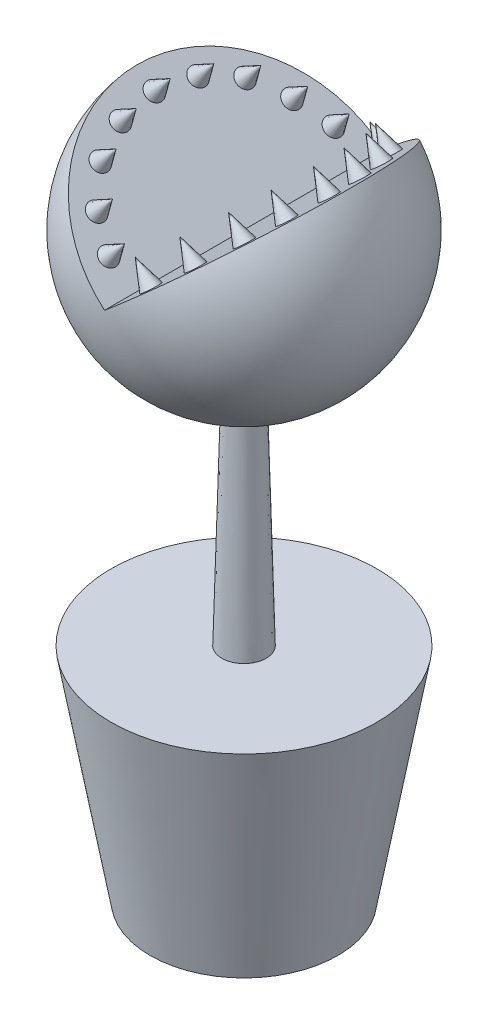
ISO-10303-21;
HEADER;
FILE_DESCRIPTION(('STEP AP214'),'2;1');
FILE_NAME('part.step','',(''),(''),'','','');
FILE_SCHEMA(('AUTOMOTIVE_DESIGN { 1 0 10303 214 1 1 1 1 }'));
ENDSEC;
DATA;
#1=APPLICATION_CONTEXT('core data for automotive mechanical design processes');
#2=APPLICATION_PROTOCOL_DEFINITION('international standard','automotive_design',2000,#1);
#3=PRODUCT_CONTEXT('',#1,'mechanical');
#4=PRODUCT('Part','Part','',(#3));
#5=PRODUCT_RELATED_PRODUCT_CATEGORY('part','',(#4));
#6=PRODUCT_DEFINITION_FORMATION('','',#4);
#7=PRODUCT_DEFINITION_CONTEXT('part definition',#1,'design');
#8=PRODUCT_DEFINITION('design','',#6,#7);
#9=PRODUCT_DEFINITION_SHAPE('','',#8);
#10=(LENGTH_UNIT() NAMED_UNIT(*) SI_UNIT(.MILLI.,.METRE.));
#11=(NAMED_UNIT(*) PLANE_ANGLE_UNIT() SI_UNIT($,.RADIAN.));
#12=(NAMED_UNIT(*) SI_UNIT($,.STERADIAN.) SOLID_ANGLE_UNIT());
#13=UNCERTAINTY_MEASURE_WITH_UNIT(LENGTH_MEASURE(1.E-05),#10,'distance_accuracy_value','');
#14=(GEOMETRIC_REPRESENTATION_CONTEXT(3) GLOBAL_UNCERTAINTY_ASSIGNED_CONTEXT((#13)) GLOBAL_UNIT_ASSIGNED_CONTEXT((#10,
#11,#12)) REPRESENTATION_CONTEXT('',''));
#15=CARTESIAN_POINT('',(0.,0.,0.));
#16=DIRECTION('',(0.,0.,1.));
#17=DIRECTION('',(1.,0.,0.));
#18=AXIS2_PLACEMENT_3D('',#15,#16,#17);
#19=CARTESIAN_POINT('',(0.,0.,0.));
#20=DIRECTION('',(0.,1.,0.));
#21=DIRECTION('',(0.,0.,1.));
#22=AXIS2_PLACEMENT_3D('',#19,#20,#21);
#23=CONICAL_SURFACE('',#22,24.,0.174532925199433);
#24=CARTESIAN_POINT('',(0.,-40.,0.));
#25=DIRECTION('',(0.,1.,0.));
#26=DIRECTION('',(0.,0.,1.));
#27=AXIS2_PLACEMENT_3D('',#24,#25,#26);
#28=CIRCLE('',#27,16.9469207716614);
#29=CARTESIAN_POINT('',(0.,-40.,16.9469207716614));
#30=VERTEX_POINT('',#29);
#31=EDGE_CURVE('E183',#30,#30,#28,.T.);
#32=ORIENTED_EDGE('',*,*,#31,.T.);
#33=EDGE_LOOP('',(#32));
#34=FACE_BOUND('',#33,.T.);
#35=CARTESIAN_POINT('',(0.,0.,0.));
#36=DIRECTION('',(0.,1.,0.));
#37=DIRECTION('',(0.,0.,1.));
#38=AXIS2_PLACEMENT_3D('',#35,#36,#37);
#39=CIRCLE('',#38,24.);
#40=CARTESIAN_POINT('',(0.,0.,24.));
#41=VERTEX_POINT('',#40);
#42=EDGE_CURVE('E186',#41,#41,#39,.T.);
#43=ORIENTED_EDGE('',*,*,#42,.F.);
#44=EDGE_LOOP('',(#43));
#45=FACE_BOUND('',#44,.T.);
#46=ADVANCED_FACE('F33',(#34,#45),#23,.T.);
#47=CARTESIAN_POINT('',(0.,-40.,0.));
#48=DIRECTION('',(0.,1.,0.));
#49=DIRECTION('',(0.,0.,1.));
#50=AXIS2_PLACEMENT_3D('',#47,#48,#49);
#51=PLANE('',#50);
#52=ORIENTED_EDGE('',*,*,#31,.F.);
#53=EDGE_LOOP('',(#52));
#54=FACE_BOUND('',#53,.T.);
#55=ADVANCED_FACE('F172',(#54),#51,.F.);
#56=CARTESIAN_POINT('',(0.,0.,0.));
#57=DIRECTION('',(0.,1.,0.));
#58=DIRECTION('',(0.,0.,1.));
#59=AXIS2_PLACEMENT_3D('',#56,#57,#58);
#60=PLANE('',#59);
#61=CARTESIAN_POINT('',(0.,0.,0.));
#62=DIRECTION('',(0.,1.,0.));
#63=DIRECTION('',(0.,0.,1.));
#64=AXIS2_PLACEMENT_3D('',#61,#62,#63);
#65=CIRCLE('',#64,4.);
#66=CARTESIAN_POINT('',(0.,0.,4.));
#67=VERTEX_POINT('',#66);
#68=EDGE_CURVE('E151',#67,#67,#65,.T.);
#69=ORIENTED_EDGE('',*,*,#68,.F.);
#70=EDGE_LOOP('',(#69));
#71=FACE_BOUND('',#70,.T.);
#72=ORIENTED_EDGE('',*,*,#42,.T.);
#73=EDGE_LOOP('',(#72));
#74=FACE_BOUND('',#73,.T.);
#75=ADVANCED_FACE('F177',(#71,#74),#60,.T.);
#76=CARTESIAN_POINT('',(0.,0.,0.));
#77=DIRECTION('',(0.,-1.,0.));
#78=DIRECTION('',(0.,0.,1.));
#79=AXIS2_PLACEMENT_3D('',#76,#77,#78);
#80=CONICAL_SURFACE('',#79,4.,0.026179938779915);
#81=CARTESIAN_POINT('',(0.,39.9975543267412,0.));
#82=DIRECTION('',(0.,1.,0.));
#83=DIRECTION('',(0.,0.,1.));
#84=AXIS2_PLACEMENT_3D('',#81,#82,#83);
#85=CIRCLE('',#84,2.95262717944066);
#86=CARTESIAN_POINT('',(0.,39.9975543267412,2.95262717944066));
#87=VERTEX_POINT('',#86);
#88=EDGE_CURVE('E154',#87,#87,#85,.F.);
#89=ORIENTED_EDGE('',*,*,#88,.T.);
#90=EDGE_LOOP('',(#89));
#91=FACE_BOUND('',#90,.T.);
#92=ORIENTED_EDGE('',*,*,#68,.T.);
#93=EDGE_LOOP('',(#92));
#94=FACE_BOUND('',#93,.T.);
#95=ADVANCED_FACE('F251',(#91,#94),#80,.T.);
#96=CARTESIAN_POINT('',(0.,65.,0.));
#97=DIRECTION('',(0.,0.,1.));
#98=DIRECTION('',(0.766044443118973,-0.642787609686546,0.));
#99=AXIS2_PLACEMENT_3D('',#96,#97,#98);
#100=SPHERICAL_SURFACE('',#99,25.1761851142112);
#101=CARTESIAN_POINT('',(0.,65.,0.));
#102=DIRECTION('',(-0.642787609686546,-0.766044443118973,0.));
#103=DIRECTION('',(0.,0.,1.));
#104=AXIS2_PLACEMENT_3D('',#101,#102,#103);
#105=CIRCLE('',#104,25.1761851142112);
#106=CARTESIAN_POINT('',(2.63677968348475E-13,65.,25.1761851142112));
#107=VERTEX_POINT('',#106);
#108=CARTESIAN_POINT('',(0.,65.,-25.1761851142112));
#109=VERTEX_POINT('',#108);
#110=EDGE_CURVE('E49',#107,#109,#105,.T.);
#111=ORIENTED_EDGE('',*,*,#110,.T.);
#112=CARTESIAN_POINT('',(0.,65.,0.));
#113=DIRECTION('',(-0.64278760968654,0.766044443118977,0.));
#114=DIRECTION('',(0.,0.,1.));
#115=AXIS2_PLACEMENT_3D('',#112,#113,#114);
#116=CIRCLE('',#115,25.1761851142112);
#117=EDGE_CURVE('E195',#107,#109,#116,.T.);
#118=ORIENTED_EDGE('',*,*,#117,.F.);
#119=EDGE_LOOP('',(#111,#118));
#120=FACE_BOUND('',#119,.T.);
#121=ORIENTED_EDGE('',*,*,#88,.F.);
#122=EDGE_LOOP('',(#121));
#123=FACE_BOUND('',#122,.T.);
#124=ADVANCED_FACE('F116',(#120,#123),#100,.T.);
#125=CARTESIAN_POINT('',(0.,65.,0.));
#126=DIRECTION('',(-0.642787609686546,-0.766044443118973,0.));
#127=DIRECTION('',(0.,0.,1.));
#128=AXIS2_PLACEMENT_3D('',#125,#126,#127);
#129=PLANE('',#128);
#130=CARTESIAN_POINT('',(-4.38041095470587,68.6756012164987,-20.516387506273));
#131=DIRECTION('',(-0.642787609686546,-0.766044443118973,0.));
#132=DIRECTION('',(0.766044443118973,-0.642787609686546,0.));
#133=AXIS2_PLACEMENT_3D('',#130,#131,#132);
#134=CIRCLE('',#133,1.61785437442828);
#135=CARTESIAN_POINT('',(-3.14106260139937,67.635664470339,-20.516387506273));
#136=VERTEX_POINT('',#135);
#137=EDGE_CURVE('E11',#136,#136,#134,.F.);
#138=ORIENTED_EDGE('',*,*,#137,.F.);
#139=EDGE_LOOP('',(#138));
#140=FACE_BOUND('',#139,.T.);
#141=CARTESIAN_POINT('',(-8.77035119301671,72.3591984513557,-17.4317283621743));
#142=DIRECTION('',(-0.642787609686546,-0.766044443118973,0.));
#143=DIRECTION('',(0.766044443118973,-0.642787609686546,0.));
#144=AXIS2_PLACEMENT_3D('',#141,#142,#143);
#145=CIRCLE('',#144,1.61785437442828);
#146=CARTESIAN_POINT('',(-7.53100283971021,71.319261705196,-17.4317283621743));
#147=VERTEX_POINT('',#146);
#148=EDGE_CURVE('E40',#147,#147,#145,.F.);
#149=ORIENTED_EDGE('',*,*,#148,.F.);
#150=EDGE_LOOP('',(#149));
#151=FACE_BOUND('',#150,.T.);
#152=CARTESIAN_POINT('',(-15.2967132924366,77.8354664819084,7.00802483352714));
#153=DIRECTION('',(-0.642787609686546,-0.766044443118973,0.));
#154=DIRECTION('',(0.766044443118973,-0.642787609686546,0.));
#155=AXIS2_PLACEMENT_3D('',#152,#153,#154);
#156=CIRCLE('',#155,1.61785437442828);
#157=CARTESIAN_POINT('',(-14.0573649391301,76.7955297357487,7.00802483352714));
#158=VERTEX_POINT('',#157);
#159=EDGE_CURVE('E124',#158,#158,#156,.F.);
#160=ORIENTED_EDGE('',*,*,#159,.F.);
#161=EDGE_LOOP('',(#160));
#162=FACE_BOUND('',#161,.T.);
#163=CARTESIAN_POINT('',(-12.8462406510636,75.7792757923222,-13.0405184285278));
#164=DIRECTION('',(-0.642787609686546,-0.766044443118973,0.));
#165=DIRECTION('',(0.766044443118973,-0.642787609686546,0.));
#166=AXIS2_PLACEMENT_3D('',#163,#164,#165);
#167=CIRCLE('',#166,1.61785437442829);
#168=CARTESIAN_POINT('',(-11.6068922977571,74.7393390461626,-13.0405184285278));
#169=VERTEX_POINT('',#168);
#170=EDGE_CURVE('E128',#169,#169,#167,.F.);
#171=ORIENTED_EDGE('',*,*,#170,.F.);
#172=EDGE_LOOP('',(#171));
#173=FACE_BOUND('',#172,.T.);
#174=CARTESIAN_POINT('',(-15.2967132924366,77.8354664819084,-6.99686955458123));
#175=DIRECTION('',(-0.642787609686546,-0.766044443118973,0.));
#176=DIRECTION('',(0.766044443118973,-0.642787609686546,0.));
#177=AXIS2_PLACEMENT_3D('',#174,#175,#176);
#178=CIRCLE('',#177,1.61785437442828);
#179=CARTESIAN_POINT('',(-14.0573649391301,76.7955297357487,-6.99686955458123));
#180=VERTEX_POINT('',#179);
#181=EDGE_CURVE('E132',#180,#180,#178,.F.);
#182=ORIENTED_EDGE('',*,*,#181,.F.);
#183=EDGE_LOOP('',(#182));
#184=FACE_BOUND('',#183,.T.);
#185=CARTESIAN_POINT('',(-8.77035119301671,72.3591984513557,17.827595446839));
#186=DIRECTION('',(-0.642787609686546,-0.766044443118973,0.));
#187=DIRECTION('',(0.766044443118973,-0.642787609686546,0.));
#188=AXIS2_PLACEMENT_3D('',#185,#186,#187);
#189=CIRCLE('',#188,1.61785437442828);
#190=CARTESIAN_POINT('',(-7.53100283971021,71.319261705196,17.827595446839));
#191=VERTEX_POINT('',#190);
#192=EDGE_CURVE('E136',#191,#191,#189,.F.);
#193=ORIENTED_EDGE('',*,*,#192,.F.);
#194=EDGE_LOOP('',(#193));
#195=FACE_BOUND('',#194,.T.);
#196=CARTESIAN_POINT('',(-12.8462406510636,75.7792757923222,13.0942259998221));
#197=DIRECTION('',(-0.642787609686546,-0.766044443118973,0.));
#198=DIRECTION('',(0.766044443118973,-0.642787609686546,0.));
#199=AXIS2_PLACEMENT_3D('',#196,#197,#198);
#200=CIRCLE('',#199,1.61785437442828);
#201=CARTESIAN_POINT('',(-11.6068922977571,74.7393390461626,13.0942259998221));
#202=VERTEX_POINT('',#201);
#203=EDGE_CURVE('E140',#202,#202,#200,.F.);
#204=ORIENTED_EDGE('',*,*,#203,.F.);
#205=EDGE_LOOP('',(#204));
#206=FACE_BOUND('',#205,.T.);
#207=CARTESIAN_POINT('',(-4.38041095470587,68.6756012164987,20.0532503142332));
#208=DIRECTION('',(-0.642787609686546,-0.766044443118973,0.));
#209=DIRECTION('',(0.766044443118973,-0.642787609686546,0.));
#210=AXIS2_PLACEMENT_3D('',#207,#208,#209);
#211=CIRCLE('',#210,1.61785437442828);
#212=CARTESIAN_POINT('',(-3.14106260139937,67.635664470339,20.0532503142332));
#213=VERTEX_POINT('',#212);
#214=EDGE_CURVE('E144',#213,#213,#211,.F.);
#215=ORIENTED_EDGE('',*,*,#214,.F.);
#216=EDGE_LOOP('',(#215));
#217=FACE_BOUND('',#216,.T.);
#218=CARTESIAN_POINT('',(-16.1772012853809,78.574283632044,0.));
#219=DIRECTION('',(-0.642787609686546,-0.766044443118973,0.));
#220=DIRECTION('',(0.766044443118973,-0.642787609686546,0.));
#221=AXIS2_PLACEMENT_3D('',#218,#219,#220);
#222=CIRCLE('',#221,1.61785437442828);
#223=CARTESIAN_POINT('',(-14.9378529320744,77.5343468858843,0.));
#224=VERTEX_POINT('',#223);
#225=EDGE_CURVE('E147',#224,#224,#222,.F.);
#226=ORIENTED_EDGE('',*,*,#225,.F.);
#227=EDGE_LOOP('',(#226));
#228=FACE_BOUND('',#227,.T.);
#229=ORIENTED_EDGE('',*,*,#110,.F.);
#230=DIRECTION('',(0.,0.,1.));
#231=VECTOR('',#230,1.);
#232=CARTESIAN_POINT('',(0.,65.,0.));
#233=LINE('',#232,#231);
#234=EDGE_CURVE('E46',#109,#107,#233,.T.);
#235=ORIENTED_EDGE('',*,*,#234,.F.);
#236=EDGE_LOOP('',(#229,#235));
#237=FACE_BOUND('',#236,.T.);
#238=ADVANCED_FACE('F112',(#140,#151,#162,#173,#184,#195,#206,#217,#228,#237),#129,.F.);
#239=CARTESIAN_POINT('',(0.,65.,0.));
#240=DIRECTION('',(-0.64278760968654,0.766044443118977,0.));
#241=DIRECTION('',(0.,0.,1.));
#242=AXIS2_PLACEMENT_3D('',#239,#240,#241);
#243=PLANE('',#242);
#244=CARTESIAN_POINT('',(4.60475355864348,68.8638470127201,-20.9722252137961));
#245=DIRECTION('',(-0.642787609686541,0.766044443118977,0.));
#246=DIRECTION('',(-0.766044443118977,-0.642787609686541,0.));
#247=AXIS2_PLACEMENT_3D('',#244,#245,#246);
#248=CIRCLE('',#247,1.61785437442827);
#249=CARTESIAN_POINT('',(3.36540520533698,67.8239102665604,-20.9722252137961));
#250=VERTEX_POINT('',#249);
#251=EDGE_CURVE('E222',#250,#250,#248,.T.);
#252=ORIENTED_EDGE('',*,*,#251,.F.);
#253=EDGE_LOOP('',(#252));
#254=FACE_BOUND('',#253,.T.);
#255=CARTESIAN_POINT('',(9.40203215375862,72.8892417125359,-17.1904642413092));
#256=DIRECTION('',(-0.642787609686541,0.766044443118977,0.));
#257=DIRECTION('',(-0.766044443118977,-0.642787609686541,0.));
#258=AXIS2_PLACEMENT_3D('',#255,#256,#257);
#259=CIRCLE('',#258,1.61785437442827);
#260=CARTESIAN_POINT('',(8.16268380045211,71.8493049663762,-17.1904642413092));
#261=VERTEX_POINT('',#260);
#262=EDGE_CURVE('E219',#261,#261,#259,.T.);
#263=ORIENTED_EDGE('',*,*,#262,.F.);
#264=EDGE_LOOP('',(#263));
#265=FACE_BOUND('',#264,.T.);
#266=CARTESIAN_POINT('',(16.3169292107717,78.6915292827043,0.925151742152258));
#267=DIRECTION('',(-0.642787609686541,0.766044443118977,0.));
#268=DIRECTION('',(-0.766044443118977,-0.642787609686541,0.));
#269=AXIS2_PLACEMENT_3D('',#266,#267,#268);
#270=CIRCLE('',#269,1.61785437442827);
#271=CARTESIAN_POINT('',(15.0775808574652,77.6515925365447,0.925151742152258));
#272=VERTEX_POINT('',#271);
#273=EDGE_CURVE('E216',#272,#272,#270,.T.);
#274=ORIENTED_EDGE('',*,*,#273,.F.);
#275=EDGE_LOOP('',(#274));
#276=FACE_BOUND('',#275,.T.);
#277=CARTESIAN_POINT('',(13.2266444031692,76.0984724404124,-11.6294071351883));
#278=DIRECTION('',(-0.642787609686541,0.766044443118977,0.));
#279=DIRECTION('',(-0.766044443118977,-0.642787609686541,0.));
#280=AXIS2_PLACEMENT_3D('',#277,#278,#279);
#281=CIRCLE('',#280,1.61785437442827);
#282=CARTESIAN_POINT('',(11.9872960498627,75.0585356942527,-11.6294071351883));
#283=VERTEX_POINT('',#282);
#284=EDGE_CURVE('E213',#283,#283,#281,.T.);
#285=ORIENTED_EDGE('',*,*,#284,.F.);
#286=EDGE_LOOP('',(#285));
#287=FACE_BOUND('',#286,.T.);
#288=CARTESIAN_POINT('',(15.31818426249,77.853482764961,-5.58775264065002));
#289=DIRECTION('',(-0.642787609686541,0.766044443118977,0.));
#290=DIRECTION('',(-0.766044443118977,-0.642787609686541,0.));
#291=AXIS2_PLACEMENT_3D('',#288,#289,#290);
#292=CIRCLE('',#291,1.61785437442827);
#293=CARTESIAN_POINT('',(14.0788359091835,76.8135460188013,-5.58775264065002));
#294=VERTEX_POINT('',#293);
#295=EDGE_CURVE('E210',#294,#294,#292,.T.);
#296=ORIENTED_EDGE('',*,*,#295,.F.);
#297=EDGE_LOOP('',(#296));
#298=FACE_BOUND('',#297,.T.);
#299=CARTESIAN_POINT('',(13.2266444031692,76.0984724404122,13.1574013715015));
#300=DIRECTION('',(-0.642787609686541,0.766044443118977,0.));
#301=DIRECTION('',(-0.766044443118977,-0.642787609686541,0.));
#302=AXIS2_PLACEMENT_3D('',#299,#300,#301);
#303=CIRCLE('',#302,1.61785437442826);
#304=CARTESIAN_POINT('',(11.9872960498627,75.0585356942526,13.1574013715015));
#305=VERTEX_POINT('',#304);
#306=EDGE_CURVE('E207',#305,#305,#303,.T.);
#307=ORIENTED_EDGE('',*,*,#306,.F.);
#308=EDGE_LOOP('',(#307));
#309=FACE_BOUND('',#308,.T.);
#310=CARTESIAN_POINT('',(15.31818426249,77.8534827649609,7.58254018123285));
#311=DIRECTION('',(-0.642787609686541,0.766044443118977,0.));
#312=DIRECTION('',(-0.766044443118977,-0.642787609686541,0.));
#313=AXIS2_PLACEMENT_3D('',#310,#311,#312);
#314=CIRCLE('',#313,1.61785437442827);
#315=CARTESIAN_POINT('',(14.0788359091835,76.8135460188013,7.58254018123285));
#316=VERTEX_POINT('',#315);
#317=EDGE_CURVE('E204',#316,#316,#314,.T.);
#318=ORIENTED_EDGE('',*,*,#317,.F.);
#319=EDGE_LOOP('',(#318));
#320=FACE_BOUND('',#319,.T.);
#321=CARTESIAN_POINT('',(9.40203215375862,72.8892417125357,18.1454323912367));
#322=DIRECTION('',(-0.642787609686541,0.766044443118977,0.));
#323=DIRECTION('',(-0.766044443118977,-0.642787609686541,0.));
#324=AXIS2_PLACEMENT_3D('',#321,#322,#323);
#325=CIRCLE('',#324,1.61785437442826);
#326=CARTESIAN_POINT('',(8.16268380045212,71.849304966376,18.1454323912367));
#327=VERTEX_POINT('',#326);
#328=EDGE_CURVE('E201',#327,#327,#325,.T.);
#329=ORIENTED_EDGE('',*,*,#328,.F.);
#330=EDGE_LOOP('',(#329));
#331=FACE_BOUND('',#330,.T.);
#332=CARTESIAN_POINT('',(4.60475355864348,68.8638470127199,21.3810754714818));
#333=DIRECTION('',(-0.642787609686541,0.766044443118977,0.));
#334=DIRECTION('',(-0.766044443118977,-0.642787609686541,0.));
#335=AXIS2_PLACEMENT_3D('',#332,#333,#334);
#336=CIRCLE('',#335,1.61785437442827);
#337=CARTESIAN_POINT('',(3.36540520533698,67.8239102665602,21.3810754714818));
#338=VERTEX_POINT('',#337);
#339=EDGE_CURVE('E198',#338,#338,#336,.T.);
#340=ORIENTED_EDGE('',*,*,#339,.F.);
#341=EDGE_LOOP('',(#340));
#342=FACE_BOUND('',#341,.T.);
#343=ORIENTED_EDGE('',*,*,#117,.T.);
#344=ORIENTED_EDGE('',*,*,#234,.T.);
#345=EDGE_LOOP('',(#343,#344));
#346=FACE_BOUND('',#345,.T.);
#347=ADVANCED_FACE('F115',(#254,#265,#276,#287,#298,#309,#320,#331,#342,#346),#243,.T.);
#348=CARTESIAN_POINT('',(4.60475355864348,68.8638470127199,21.3810754714818));
#349=DIRECTION('',(0.642787609686541,-0.766044443118977,0.));
#350=DIRECTION('',(-0.766044443118977,-0.642787609686541,0.));
#351=AXIS2_PLACEMENT_3D('',#348,#349,#350);
#352=CONICAL_SURFACE('',#351,1.61785437442827,0.349065850398867);
#353=CARTESIAN_POINT('',(1.7475508309087,72.2689286282677,21.3810754714818));
#354=VERTEX_POINT('',#353);
#355=VERTEX_LOOP('',#354);
#356=FACE_BOUND('',#355,.T.);
#357=ORIENTED_EDGE('',*,*,#339,.T.);
#358=EDGE_LOOP('',(#357));
#359=FACE_BOUND('',#358,.T.);
#360=ADVANCED_FACE('F230',(#356,#359),#352,.T.);
#361=CARTESIAN_POINT('',(9.40203215375862,72.8892417125357,18.1454323912367));
#362=DIRECTION('',(0.642787609686541,-0.766044443118977,0.));
#363=DIRECTION('',(-0.766044443118977,-0.642787609686541,0.));
#364=AXIS2_PLACEMENT_3D('',#361,#362,#363);
#365=CONICAL_SURFACE('',#364,1.61785437442826,0.349065850398867);
#366=CARTESIAN_POINT('',(6.54482942602386,76.2943233280835,18.1454323912367));
#367=VERTEX_POINT('',#366);
#368=VERTEX_LOOP('',#367);
#369=FACE_BOUND('',#368,.T.);
#370=ORIENTED_EDGE('',*,*,#328,.T.);
#371=EDGE_LOOP('',(#370));
#372=FACE_BOUND('',#371,.T.);
#373=ADVANCED_FACE('F266',(#369,#372),#365,.T.);
#374=CARTESIAN_POINT('',(15.31818426249,77.8534827649609,7.58254018123285));
#375=DIRECTION('',(0.642787609686541,-0.766044443118977,0.));
#376=DIRECTION('',(-0.766044443118977,-0.642787609686541,0.));
#377=AXIS2_PLACEMENT_3D('',#374,#375,#376);
#378=CONICAL_SURFACE('',#377,1.61785437442827,0.349065850398867);
#379=CARTESIAN_POINT('',(12.4609815347552,81.2585643805088,7.58254018123286));
#380=VERTEX_POINT('',#379);
#381=VERTEX_LOOP('',#380);
#382=FACE_BOUND('',#381,.T.);
#383=ORIENTED_EDGE('',*,*,#317,.T.);
#384=EDGE_LOOP('',(#383));
#385=FACE_BOUND('',#384,.T.);
#386=ADVANCED_FACE('F270',(#382,#385),#378,.T.);
#387=CARTESIAN_POINT('',(13.2266444031692,76.0984724404122,13.1574013715015));
#388=DIRECTION('',(0.642787609686541,-0.766044443118977,0.));
#389=DIRECTION('',(-0.766044443118977,-0.642787609686541,0.));
#390=AXIS2_PLACEMENT_3D('',#387,#388,#389);
#391=CONICAL_SURFACE('',#390,1.61785437442826,0.349065850398867);
#392=CARTESIAN_POINT('',(10.3694416754344,79.5035540559601,13.1574013715015));
#393=VERTEX_POINT('',#392);
#394=VERTEX_LOOP('',#393);
#395=FACE_BOUND('',#394,.T.);
#396=ORIENTED_EDGE('',*,*,#306,.T.);
#397=EDGE_LOOP('',(#396));
#398=FACE_BOUND('',#397,.T.);
#399=ADVANCED_FACE('F274',(#395,#398),#391,.T.);
#400=CARTESIAN_POINT('',(15.31818426249,77.853482764961,-5.58775264065002));
#401=DIRECTION('',(0.642787609686541,-0.766044443118977,0.));
#402=DIRECTION('',(-0.766044443118977,-0.642787609686541,0.));
#403=AXIS2_PLACEMENT_3D('',#400,#401,#402);
#404=CONICAL_SURFACE('',#403,1.61785437442827,0.349065850398867);
#405=CARTESIAN_POINT('',(12.4609815347552,81.2585643805089,-5.58775264065));
#406=VERTEX_POINT('',#405);
#407=VERTEX_LOOP('',#406);
#408=FACE_BOUND('',#407,.T.);
#409=ORIENTED_EDGE('',*,*,#295,.T.);
#410=EDGE_LOOP('',(#409));
#411=FACE_BOUND('',#410,.T.);
#412=ADVANCED_FACE('F278',(#408,#411),#404,.T.);
#413=CARTESIAN_POINT('',(13.2266444031692,76.0984724404124,-11.6294071351883));
#414=DIRECTION('',(0.642787609686541,-0.766044443118977,0.));
#415=DIRECTION('',(-0.766044443118977,-0.642787609686541,0.));
#416=AXIS2_PLACEMENT_3D('',#413,#414,#415);
#417=CONICAL_SURFACE('',#416,1.61785437442827,0.349065850398867);
#418=CARTESIAN_POINT('',(10.3694416754344,79.5035540559603,-11.6294071351883));
#419=VERTEX_POINT('',#418);
#420=VERTEX_LOOP('',#419);
#421=FACE_BOUND('',#420,.T.);
#422=ORIENTED_EDGE('',*,*,#284,.T.);
#423=EDGE_LOOP('',(#422));
#424=FACE_BOUND('',#423,.T.);
#425=ADVANCED_FACE('F282',(#421,#424),#417,.T.);
#426=CARTESIAN_POINT('',(16.3169292107717,78.6915292827043,0.925151742152258));
#427=DIRECTION('',(0.642787609686541,-0.766044443118977,0.));
#428=DIRECTION('',(-0.766044443118977,-0.642787609686541,0.));
#429=AXIS2_PLACEMENT_3D('',#426,#427,#428);
#430=CONICAL_SURFACE('',#429,1.61785437442827,0.349065850398867);
#431=CARTESIAN_POINT('',(13.4597264830369,82.0966108982522,0.925151742152278));
#432=VERTEX_POINT('',#431);
#433=VERTEX_LOOP('',#432);
#434=FACE_BOUND('',#433,.T.);
#435=ORIENTED_EDGE('',*,*,#273,.T.);
#436=EDGE_LOOP('',(#435));
#437=FACE_BOUND('',#436,.T.);
#438=ADVANCED_FACE('F286',(#434,#437),#430,.T.);
#439=CARTESIAN_POINT('',(9.40203215375862,72.8892417125359,-17.1904642413092));
#440=DIRECTION('',(0.642787609686541,-0.766044443118977,0.));
#441=DIRECTION('',(-0.766044443118977,-0.642787609686541,0.));
#442=AXIS2_PLACEMENT_3D('',#439,#440,#441);
#443=CONICAL_SURFACE('',#442,1.61785437442827,0.349065850398867);
#444=CARTESIAN_POINT('',(6.54482942602384,76.2943233280838,-17.1904642413092));
#445=VERTEX_POINT('',#444);
#446=VERTEX_LOOP('',#445);
#447=FACE_BOUND('',#446,.T.);
#448=ORIENTED_EDGE('',*,*,#262,.T.);
#449=EDGE_LOOP('',(#448));
#450=FACE_BOUND('',#449,.T.);
#451=ADVANCED_FACE('F290',(#447,#450),#443,.T.);
#452=CARTESIAN_POINT('',(4.60475355864348,68.8638470127201,-20.9722252137961));
#453=DIRECTION('',(0.642787609686541,-0.766044443118977,0.));
#454=DIRECTION('',(-0.766044443118977,-0.642787609686541,0.));
#455=AXIS2_PLACEMENT_3D('',#452,#453,#454);
#456=CONICAL_SURFACE('',#455,1.61785437442827,0.349065850398867);
#457=CARTESIAN_POINT('',(1.7475508309087,72.268928628268,-20.9722252137961));
#458=VERTEX_POINT('',#457);
#459=VERTEX_LOOP('',#458);
#460=FACE_BOUND('',#459,.T.);
#461=ORIENTED_EDGE('',*,*,#251,.T.);
#462=EDGE_LOOP('',(#461));
#463=FACE_BOUND('',#462,.T.);
#464=ADVANCED_FACE('F226',(#460,#463),#456,.T.);
#465=CARTESIAN_POINT('',(-16.1772012853809,78.574283632044,0.));
#466=DIRECTION('',(-0.642787609686546,-0.766044443118973,0.));
#467=DIRECTION('',(-0.766044443118973,0.642787609686546,0.));
#468=AXIS2_PLACEMENT_3D('',#465,#466,#467);
#469=CONICAL_SURFACE('',#468,1.61785437442827,0.349065850398867);
#470=CARTESIAN_POINT('',(-13.3199985576461,81.9793652475918,0.));
#471=VERTEX_POINT('',#470);
#472=VERTEX_LOOP('',#471);
#473=FACE_BOUND('',#472,.T.);
#474=ORIENTED_EDGE('',*,*,#225,.T.);
#475=EDGE_LOOP('',(#474));
#476=FACE_BOUND('',#475,.T.);
#477=ADVANCED_FACE('F297',(#473,#476),#469,.T.);
#478=CARTESIAN_POINT('',(-4.38041095470586,68.6756012164987,20.0532503142332));
#479=DIRECTION('',(-0.642787609686546,-0.766044443118973,0.));
#480=DIRECTION('',(-0.766044443118973,0.642787609686546,0.));
#481=AXIS2_PLACEMENT_3D('',#478,#479,#480);
#482=CONICAL_SURFACE('',#481,1.61785437442827,0.349065850398867);
#483=CARTESIAN_POINT('',(-1.52320822697106,72.0806828320465,20.0532503142332));
#484=VERTEX_POINT('',#483);
#485=VERTEX_LOOP('',#484);
#486=FACE_BOUND('',#485,.T.);
#487=ORIENTED_EDGE('',*,*,#214,.T.);
#488=EDGE_LOOP('',(#487));
#489=FACE_BOUND('',#488,.T.);
#490=ADVANCED_FACE('F301',(#486,#489),#482,.T.);
#491=CARTESIAN_POINT('',(-12.8462406510636,75.7792757923223,13.0942259998221));
#492=DIRECTION('',(-0.642787609686546,-0.766044443118973,0.));
#493=DIRECTION('',(-0.766044443118973,0.642787609686546,0.));
#494=AXIS2_PLACEMENT_3D('',#491,#492,#493);
#495=CONICAL_SURFACE('',#494,1.61785437442827,0.349065850398867);
#496=CARTESIAN_POINT('',(-9.98903792332879,79.1843574078701,13.0942259998221));
#497=VERTEX_POINT('',#496);
#498=VERTEX_LOOP('',#497);
#499=FACE_BOUND('',#498,.T.);
#500=ORIENTED_EDGE('',*,*,#203,.T.);
#501=EDGE_LOOP('',(#500));
#502=FACE_BOUND('',#501,.T.);
#503=ADVANCED_FACE('F305',(#499,#502),#495,.T.);
#504=CARTESIAN_POINT('',(-8.7703511930167,72.3591984513557,17.827595446839));
#505=DIRECTION('',(-0.642787609686546,-0.766044443118973,0.));
#506=DIRECTION('',(-0.766044443118973,0.642787609686546,0.));
#507=AXIS2_PLACEMENT_3D('',#504,#505,#506);
#508=CONICAL_SURFACE('',#507,1.61785437442827,0.349065850398867);
#509=CARTESIAN_POINT('',(-5.9131484652819,75.7642800669035,17.827595446839));
#510=VERTEX_POINT('',#509);
#511=VERTEX_LOOP('',#510);
#512=FACE_BOUND('',#511,.T.);
#513=ORIENTED_EDGE('',*,*,#192,.T.);
#514=EDGE_LOOP('',(#513));
#515=FACE_BOUND('',#514,.T.);
#516=ADVANCED_FACE('F309',(#512,#515),#508,.T.);
#517=CARTESIAN_POINT('',(-15.2967132924366,77.8354664819084,-6.99686955458123));
#518=DIRECTION('',(-0.642787609686546,-0.766044443118973,0.));
#519=DIRECTION('',(-0.766044443118973,0.642787609686546,0.));
#520=AXIS2_PLACEMENT_3D('',#517,#518,#519);
#521=CONICAL_SURFACE('',#520,1.61785437442827,0.349065850398867);
#522=CARTESIAN_POINT('',(-12.4395105647018,81.2405480974562,-6.99686955458123));
#523=VERTEX_POINT('',#522);
#524=VERTEX_LOOP('',#523);
#525=FACE_BOUND('',#524,.T.);
#526=ORIENTED_EDGE('',*,*,#181,.T.);
#527=EDGE_LOOP('',(#526));
#528=FACE_BOUND('',#527,.T.);
#529=ADVANCED_FACE('F313',(#525,#528),#521,.T.);
#530=CARTESIAN_POINT('',(-12.8462406510636,75.7792757923223,-13.0405184285278));
#531=DIRECTION('',(-0.642787609686546,-0.766044443118973,0.));
#532=DIRECTION('',(-0.766044443118973,0.642787609686546,0.));
#533=AXIS2_PLACEMENT_3D('',#530,#531,#532);
#534=CONICAL_SURFACE('',#533,1.61785437442828,0.349065850398867);
#535=CARTESIAN_POINT('',(-9.98903792332877,79.1843574078702,-13.0405184285278));
#536=VERTEX_POINT('',#535);
#537=VERTEX_LOOP('',#536);
#538=FACE_BOUND('',#537,.T.);
#539=ORIENTED_EDGE('',*,*,#170,.T.);
#540=EDGE_LOOP('',(#539));
#541=FACE_BOUND('',#540,.T.);
#542=ADVANCED_FACE('F168',(#538,#541),#534,.T.);
#543=CARTESIAN_POINT('',(-15.2967132924366,77.8354664819084,7.00802483352714));
#544=DIRECTION('',(-0.642787609686546,-0.766044443118973,0.));
#545=DIRECTION('',(-0.766044443118973,0.642787609686546,0.));
#546=AXIS2_PLACEMENT_3D('',#543,#544,#545);
#547=CONICAL_SURFACE('',#546,1.61785437442827,0.349065850398867);
#548=CARTESIAN_POINT('',(-12.4395105647018,81.2405480974562,7.00802483352714));
#549=VERTEX_POINT('',#548);
#550=VERTEX_LOOP('',#549);
#551=FACE_BOUND('',#550,.T.);
#552=ORIENTED_EDGE('',*,*,#159,.T.);
#553=EDGE_LOOP('',(#552));
#554=FACE_BOUND('',#553,.T.);
#555=ADVANCED_FACE('F162',(#551,#554),#547,.T.);
#556=CARTESIAN_POINT('',(-8.7703511930167,72.3591984513557,-17.4317283621743));
#557=DIRECTION('',(-0.642787609686546,-0.766044443118973,0.));
#558=DIRECTION('',(-0.766044443118973,0.642787609686546,0.));
#559=AXIS2_PLACEMENT_3D('',#556,#557,#558);
#560=CONICAL_SURFACE('',#559,1.61785437442827,0.349065850398867);
#561=CARTESIAN_POINT('',(-5.9131484652819,75.7642800669035,-17.4317283621743));
#562=VERTEX_POINT('',#561);
#563=VERTEX_LOOP('',#562);
#564=FACE_BOUND('',#563,.T.);
#565=ORIENTED_EDGE('',*,*,#148,.T.);
#566=EDGE_LOOP('',(#565));
#567=FACE_BOUND('',#566,.T.);
#568=ADVANCED_FACE('F108',(#564,#567),#560,.T.);
#569=CARTESIAN_POINT('',(-4.38041095470586,68.6756012164987,-20.516387506273));
#570=DIRECTION('',(-0.642787609686546,-0.766044443118973,0.));
#571=DIRECTION('',(-0.766044443118973,0.642787609686546,0.));
#572=AXIS2_PLACEMENT_3D('',#569,#570,#571);
#573=CONICAL_SURFACE('',#572,1.61785437442827,0.349065850398867);
#574=CARTESIAN_POINT('',(-1.52320822697106,72.0806828320465,-20.516387506273));
#575=VERTEX_POINT('',#574);
#576=VERTEX_LOOP('',#575);
#577=FACE_BOUND('',#576,.T.);
#578=ORIENTED_EDGE('',*,*,#137,.T.);
#579=EDGE_LOOP('',(#578));
#580=FACE_BOUND('',#579,.T.);
#581=ADVANCED_FACE('F105',(#577,#580),#573,.T.);
#582=CLOSED_SHELL('',(#46,#55,#75,#95,#124,#238,#347,#360,#373,#386,#399,#412,#425,#438,#451,
#464,#477,#490,#503,#516,#529,#542,#555,#568,#581));
#583=MANIFOLD_SOLID_BREP('B2',#582);
#584=ADVANCED_BREP_SHAPE_REPRESENTATION('',(#18,#583),#14);
#585=SHAPE_DEFINITION_REPRESENTATION(#9,#584);
ENDSEC;
END-ISO-10303-21;
